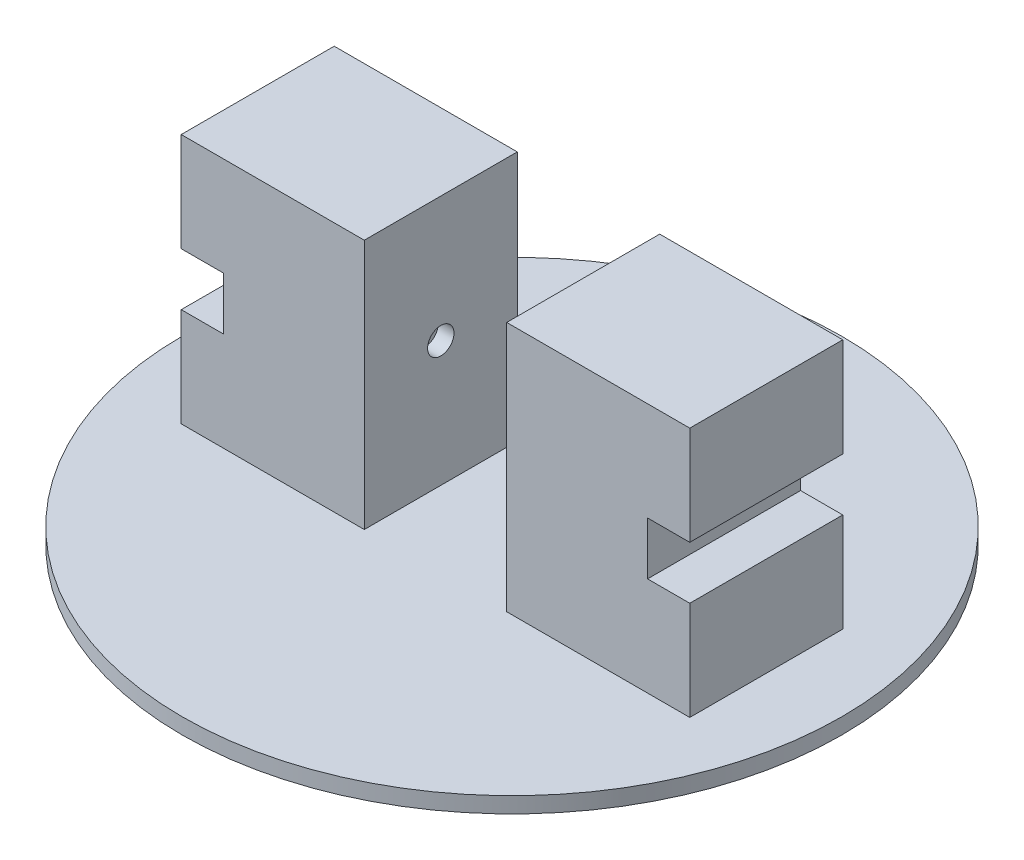
ISO-10303-21;
HEADER;
FILE_DESCRIPTION(('STEP AP214'),'2;1');
FILE_NAME('part.step','',(''),(''),'','','');
FILE_SCHEMA(('AUTOMOTIVE_DESIGN { 1 0 10303 214 1 1 1 1 }'));
ENDSEC;
DATA;
#1=APPLICATION_CONTEXT('core data for automotive mechanical design processes');
#2=APPLICATION_PROTOCOL_DEFINITION('international standard','automotive_design',2000,#1);
#3=PRODUCT_CONTEXT('',#1,'mechanical');
#4=PRODUCT('Part','Part','',(#3));
#5=PRODUCT_RELATED_PRODUCT_CATEGORY('part','',(#4));
#6=PRODUCT_DEFINITION_FORMATION('','',#4);
#7=PRODUCT_DEFINITION_CONTEXT('part definition',#1,'design');
#8=PRODUCT_DEFINITION('design','',#6,#7);
#9=PRODUCT_DEFINITION_SHAPE('','',#8);
#10=(LENGTH_UNIT() NAMED_UNIT(*) SI_UNIT(.MILLI.,.METRE.));
#11=(NAMED_UNIT(*) PLANE_ANGLE_UNIT() SI_UNIT($,.RADIAN.));
#12=(NAMED_UNIT(*) SI_UNIT($,.STERADIAN.) SOLID_ANGLE_UNIT());
#13=UNCERTAINTY_MEASURE_WITH_UNIT(LENGTH_MEASURE(1.E-05),#10,'distance_accuracy_value','');
#14=(GEOMETRIC_REPRESENTATION_CONTEXT(3) GLOBAL_UNCERTAINTY_ASSIGNED_CONTEXT((#13)) GLOBAL_UNIT_ASSIGNED_CONTEXT((#10,
#11,#12)) REPRESENTATION_CONTEXT('',''));
#15=CARTESIAN_POINT('',(0.,0.,0.));
#16=DIRECTION('',(0.,0.,1.));
#17=DIRECTION('',(1.,0.,0.));
#18=AXIS2_PLACEMENT_3D('',#15,#16,#17);
#19=CARTESIAN_POINT('',(34.7,0.,29.));
#20=DIRECTION('',(-1.,0.,0.));
#21=DIRECTION('',(0.,0.,1.));
#22=AXIS2_PLACEMENT_3D('',#19,#20,#21);
#23=PLANE('',#22);
#24=DIRECTION('',(0.,1.,0.));
#25=VECTOR('',#24,1.);
#26=CARTESIAN_POINT('',(34.7,0.,29.));
#27=LINE('',#26,#25);
#28=CARTESIAN_POINT('',(34.7,28.75,29.));
#29=VERTEX_POINT('',#28);
#30=CARTESIAN_POINT('',(34.7,47.5,29.));
#31=VERTEX_POINT('',#30);
#32=EDGE_CURVE('E248',#29,#31,#27,.T.);
#33=ORIENTED_EDGE('',*,*,#32,.F.);
#34=DIRECTION('',(0.,0.,1.));
#35=VECTOR('',#34,1.);
#36=CARTESIAN_POINT('',(34.7,28.75,29.));
#37=LINE('',#36,#35);
#38=CARTESIAN_POINT('',(34.7,28.75,0.));
#39=VERTEX_POINT('',#38);
#40=EDGE_CURVE('E223',#39,#29,#37,.T.);
#41=ORIENTED_EDGE('',*,*,#40,.F.);
#42=DIRECTION('',(0.,1.,0.));
#43=VECTOR('',#42,1.);
#44=CARTESIAN_POINT('',(34.7,0.,0.));
#45=LINE('',#44,#43);
#46=CARTESIAN_POINT('',(34.7,47.5,0.));
#47=VERTEX_POINT('',#46);
#48=EDGE_CURVE('E259',#39,#47,#45,.T.);
#49=ORIENTED_EDGE('',*,*,#48,.T.);
#50=DIRECTION('',(0.,0.,-1.));
#51=VECTOR('',#50,1.);
#52=CARTESIAN_POINT('',(34.7,47.5,29.));
#53=LINE('',#52,#51);
#54=EDGE_CURVE('E266',#31,#47,#53,.T.);
#55=ORIENTED_EDGE('',*,*,#54,.F.);
#56=EDGE_LOOP('',(#33,#41,#49,#55));
#57=FACE_BOUND('',#56,.T.);
#58=ADVANCED_FACE('F38',(#57),#23,.F.);
#59=CARTESIAN_POINT('',(0.,0.,29.));
#60=DIRECTION('',(1.,0.,0.));
#61=DIRECTION('',(0.,0.,-1.));
#62=AXIS2_PLACEMENT_3D('',#59,#60,#61);
#63=PLANE('',#62);
#64=CARTESIAN_POINT('',(0.,23.75,14.5));
#65=DIRECTION('',(-1.,0.,0.));
#66=DIRECTION('',(0.,0.,1.));
#67=AXIS2_PLACEMENT_3D('',#64,#65,#66);
#68=CIRCLE('',#67,2.5);
#69=CARTESIAN_POINT('',(0.,23.75,17.));
#70=VERTEX_POINT('',#69);
#71=EDGE_CURVE('E559',#70,#70,#68,.T.);
#72=ORIENTED_EDGE('',*,*,#71,.F.);
#73=EDGE_LOOP('',(#72));
#74=FACE_BOUND('',#73,.T.);
#75=DIRECTION('',(0.,-1.,0.));
#76=VECTOR('',#75,1.);
#77=CARTESIAN_POINT('',(0.,0.,0.));
#78=LINE('',#77,#76);
#79=CARTESIAN_POINT('',(0.,47.5,0.));
#80=VERTEX_POINT('',#79);
#81=CARTESIAN_POINT('',(0.,0.,0.));
#82=VERTEX_POINT('',#81);
#83=EDGE_CURVE('E236',#80,#82,#78,.T.);
#84=ORIENTED_EDGE('',*,*,#83,.T.);
#85=DIRECTION('',(0.,0.,-1.));
#86=VECTOR('',#85,1.);
#87=CARTESIAN_POINT('',(0.,0.,29.));
#88=LINE('',#87,#86);
#89=CARTESIAN_POINT('',(0.,0.,29.));
#90=VERTEX_POINT('',#89);
#91=EDGE_CURVE('E11',#90,#82,#88,.T.);
#92=ORIENTED_EDGE('',*,*,#91,.F.);
#93=DIRECTION('',(0.,-1.,0.));
#94=VECTOR('',#93,1.);
#95=CARTESIAN_POINT('',(0.,0.,29.));
#96=LINE('',#95,#94);
#97=CARTESIAN_POINT('',(0.,47.5,29.));
#98=VERTEX_POINT('',#97);
#99=EDGE_CURVE('E243',#98,#90,#96,.T.);
#100=ORIENTED_EDGE('',*,*,#99,.F.);
#101=DIRECTION('',(0.,0.,-1.));
#102=VECTOR('',#101,1.);
#103=CARTESIAN_POINT('',(0.,47.5,29.));
#104=LINE('',#103,#102);
#105=EDGE_CURVE('E254',#98,#80,#104,.T.);
#106=ORIENTED_EDGE('',*,*,#105,.T.);
#107=EDGE_LOOP('',(#84,#92,#100,#106));
#108=FACE_BOUND('',#107,.T.);
#109=ADVANCED_FACE('F40',(#74,#108),#63,.F.);
#110=CARTESIAN_POINT('',(34.7,0.,0.));
#111=VERTEX_POINT('',#110);
#112=CARTESIAN_POINT('',(34.7,18.75,0.));
#113=VERTEX_POINT('',#112);
#114=EDGE_CURVE('E260',#111,#113,#45,.T.);
#115=ORIENTED_EDGE('',*,*,#114,.T.);
#116=DIRECTION('',(0.,0.,-1.));
#117=VECTOR('',#116,1.);
#118=CARTESIAN_POINT('',(34.7,18.75,29.));
#119=LINE('',#118,#117);
#120=CARTESIAN_POINT('',(34.7,18.75,29.));
#121=VERTEX_POINT('',#120);
#122=EDGE_CURVE('E216',#121,#113,#119,.T.);
#123=ORIENTED_EDGE('',*,*,#122,.F.);
#124=CARTESIAN_POINT('',(34.7,0.,29.));
#125=VERTEX_POINT('',#124);
#126=EDGE_CURVE('E249',#125,#121,#27,.T.);
#127=ORIENTED_EDGE('',*,*,#126,.F.);
#128=DIRECTION('',(0.,0.,-1.));
#129=VECTOR('',#128,1.);
#130=CARTESIAN_POINT('',(34.7,0.,29.));
#131=LINE('',#130,#129);
#132=EDGE_CURVE('E47',#125,#111,#131,.T.);
#133=ORIENTED_EDGE('',*,*,#132,.T.);
#134=EDGE_LOOP('',(#115,#123,#127,#133));
#135=FACE_BOUND('',#134,.T.);
#136=ADVANCED_FACE('F273',(#135),#23,.F.);
#137=CARTESIAN_POINT('',(0.,47.5,29.));
#138=DIRECTION('',(0.,-1.,0.));
#139=DIRECTION('',(0.,0.,-1.));
#140=AXIS2_PLACEMENT_3D('',#137,#138,#139);
#141=PLANE('',#140);
#142=DIRECTION('',(-1.,0.,0.));
#143=VECTOR('',#142,1.);
#144=CARTESIAN_POINT('',(0.,47.5,0.));
#145=LINE('',#144,#143);
#146=EDGE_CURVE('E246',#47,#80,#145,.T.);
#147=ORIENTED_EDGE('',*,*,#146,.T.);
#148=ORIENTED_EDGE('',*,*,#105,.F.);
#149=DIRECTION('',(-1.,0.,0.));
#150=VECTOR('',#149,1.);
#151=CARTESIAN_POINT('',(0.,47.5,29.));
#152=LINE('',#151,#150);
#153=EDGE_CURVE('E252',#31,#98,#152,.T.);
#154=ORIENTED_EDGE('',*,*,#153,.F.);
#155=ORIENTED_EDGE('',*,*,#54,.T.);
#156=EDGE_LOOP('',(#147,#148,#154,#155));
#157=FACE_BOUND('',#156,.T.);
#158=ADVANCED_FACE('F292',(#157),#141,.F.);
#159=CARTESIAN_POINT('',(0.,0.,29.));
#160=DIRECTION('',(0.,0.,-1.));
#161=DIRECTION('',(-1.,0.,0.));
#162=AXIS2_PLACEMENT_3D('',#159,#160,#161);
#163=PLANE('',#162);
#164=DIRECTION('',(0.,-1.,0.));
#165=VECTOR('',#164,1.);
#166=CARTESIAN_POINT('',(26.7,28.75,29.));
#167=LINE('',#166,#165);
#168=CARTESIAN_POINT('',(26.7,28.75,29.));
#169=VERTEX_POINT('',#168);
#170=CARTESIAN_POINT('',(26.7,18.75,29.));
#171=VERTEX_POINT('',#170);
#172=EDGE_CURVE('E219',#169,#171,#167,.T.);
#173=ORIENTED_EDGE('',*,*,#172,.F.);
#174=DIRECTION('',(1.,0.,0.));
#175=VECTOR('',#174,1.);
#176=CARTESIAN_POINT('',(26.7,28.75,29.));
#177=LINE('',#176,#175);
#178=EDGE_CURVE('E233',#169,#29,#177,.T.);
#179=ORIENTED_EDGE('',*,*,#178,.T.);
#180=ORIENTED_EDGE('',*,*,#32,.T.);
#181=ORIENTED_EDGE('',*,*,#153,.T.);
#182=ORIENTED_EDGE('',*,*,#99,.T.);
#183=DIRECTION('',(1.,0.,0.));
#184=VECTOR('',#183,1.);
#185=CARTESIAN_POINT('',(0.,0.,29.));
#186=LINE('',#185,#184);
#187=EDGE_CURVE('E245',#90,#125,#186,.T.);
#188=ORIENTED_EDGE('',*,*,#187,.T.);
#189=ORIENTED_EDGE('',*,*,#126,.T.);
#190=DIRECTION('',(1.,0.,0.));
#191=VECTOR('',#190,1.);
#192=CARTESIAN_POINT('',(26.7,18.75,29.));
#193=LINE('',#192,#191);
#194=EDGE_CURVE('E230',#171,#121,#193,.T.);
#195=ORIENTED_EDGE('',*,*,#194,.F.);
#196=EDGE_LOOP('',(#173,#179,#180,#181,#182,#188,#189,#195));
#197=FACE_BOUND('',#196,.T.);
#198=ADVANCED_FACE('F303',(#197),#163,.F.);
#199=CARTESIAN_POINT('',(0.,0.,0.));
#200=DIRECTION('',(0.,0.,-1.));
#201=DIRECTION('',(-1.,0.,0.));
#202=AXIS2_PLACEMENT_3D('',#199,#200,#201);
#203=PLANE('',#202);
#204=DIRECTION('',(1.,0.,0.));
#205=VECTOR('',#204,1.);
#206=CARTESIAN_POINT('',(26.7,28.75,0.));
#207=LINE('',#206,#205);
#208=CARTESIAN_POINT('',(26.7,28.75,0.));
#209=VERTEX_POINT('',#208);
#210=EDGE_CURVE('E237',#209,#39,#207,.T.);
#211=ORIENTED_EDGE('',*,*,#210,.F.);
#212=DIRECTION('',(0.,1.,0.));
#213=VECTOR('',#212,1.);
#214=CARTESIAN_POINT('',(26.7,28.75,0.));
#215=LINE('',#214,#213);
#216=CARTESIAN_POINT('',(26.7,18.75,0.));
#217=VERTEX_POINT('',#216);
#218=EDGE_CURVE('E225',#217,#209,#215,.T.);
#219=ORIENTED_EDGE('',*,*,#218,.F.);
#220=DIRECTION('',(1.,0.,0.));
#221=VECTOR('',#220,1.);
#222=CARTESIAN_POINT('',(26.7,18.75,0.));
#223=LINE('',#222,#221);
#224=EDGE_CURVE('E239',#217,#113,#223,.T.);
#225=ORIENTED_EDGE('',*,*,#224,.T.);
#226=ORIENTED_EDGE('',*,*,#114,.F.);
#227=DIRECTION('',(1.,0.,0.));
#228=VECTOR('',#227,1.);
#229=CARTESIAN_POINT('',(0.,0.,0.));
#230=LINE('',#229,#228);
#231=EDGE_CURVE('E256',#82,#111,#230,.T.);
#232=ORIENTED_EDGE('',*,*,#231,.F.);
#233=ORIENTED_EDGE('',*,*,#83,.F.);
#234=ORIENTED_EDGE('',*,*,#146,.F.);
#235=ORIENTED_EDGE('',*,*,#48,.F.);
#236=EDGE_LOOP('',(#211,#219,#225,#226,#232,#233,#234,#235));
#237=FACE_BOUND('',#236,.T.);
#238=ADVANCED_FACE('F280',(#237),#203,.T.);
#239=CARTESIAN_POINT('',(26.7,28.75,29.));
#240=DIRECTION('',(0.,1.,0.));
#241=DIRECTION('',(0.,0.,1.));
#242=AXIS2_PLACEMENT_3D('',#239,#240,#241);
#243=PLANE('',#242);
#244=ORIENTED_EDGE('',*,*,#40,.T.);
#245=ORIENTED_EDGE('',*,*,#178,.F.);
#246=DIRECTION('',(0.,0.,1.));
#247=VECTOR('',#246,1.);
#248=CARTESIAN_POINT('',(26.7,28.75,29.));
#249=LINE('',#248,#247);
#250=EDGE_CURVE('E227',#209,#169,#249,.T.);
#251=ORIENTED_EDGE('',*,*,#250,.F.);
#252=ORIENTED_EDGE('',*,*,#210,.T.);
#253=EDGE_LOOP('',(#244,#245,#251,#252));
#254=FACE_BOUND('',#253,.T.);
#255=ADVANCED_FACE('F299',(#254),#243,.F.);
#256=CARTESIAN_POINT('',(26.7,18.75,29.));
#257=DIRECTION('',(0.,-1.,0.));
#258=DIRECTION('',(0.,0.,-1.));
#259=AXIS2_PLACEMENT_3D('',#256,#257,#258);
#260=PLANE('',#259);
#261=ORIENTED_EDGE('',*,*,#122,.T.);
#262=ORIENTED_EDGE('',*,*,#224,.F.);
#263=DIRECTION('',(0.,0.,-1.));
#264=VECTOR('',#263,1.);
#265=CARTESIAN_POINT('',(26.7,18.75,29.));
#266=LINE('',#265,#264);
#267=EDGE_CURVE('E222',#171,#217,#266,.T.);
#268=ORIENTED_EDGE('',*,*,#267,.F.);
#269=ORIENTED_EDGE('',*,*,#194,.T.);
#270=EDGE_LOOP('',(#261,#262,#268,#269));
#271=FACE_BOUND('',#270,.T.);
#272=ADVANCED_FACE('F308',(#271),#260,.F.);
#273=CARTESIAN_POINT('',(26.7,0.,0.));
#274=DIRECTION('',(1.,0.,0.));
#275=DIRECTION('',(0.,0.,-1.));
#276=AXIS2_PLACEMENT_3D('',#273,#274,#275);
#277=PLANE('',#276);
#278=ORIENTED_EDGE('',*,*,#172,.T.);
#279=ORIENTED_EDGE('',*,*,#267,.T.);
#280=ORIENTED_EDGE('',*,*,#218,.T.);
#281=ORIENTED_EDGE('',*,*,#250,.T.);
#282=EDGE_LOOP('',(#278,#279,#280,#281));
#283=FACE_BOUND('',#282,.T.);
#284=ADVANCED_FACE('F306',(#283),#277,.T.);
#285=CARTESIAN_POINT('',(-13.5,0.,14.5));
#286=DIRECTION('',(0.,-1.,0.));
#287=DIRECTION('',(0.,0.,-1.));
#288=AXIS2_PLACEMENT_3D('',#285,#286,#287);
#289=PLANE('',#288);
#290=DIRECTION('',(0.,0.,-1.));
#291=VECTOR('',#290,1.);
#292=CARTESIAN_POINT('',(-27.,0.,29.));
#293=LINE('',#292,#291);
#294=CARTESIAN_POINT('',(-27.,0.,29.));
#295=VERTEX_POINT('',#294);
#296=CARTESIAN_POINT('',(-27.,0.,0.));
#297=VERTEX_POINT('',#296);
#298=EDGE_CURVE('E54',#295,#297,#293,.T.);
#299=ORIENTED_EDGE('',*,*,#298,.F.);
#300=DIRECTION('',(1.,0.,0.));
#301=VECTOR('',#300,1.);
#302=CARTESIAN_POINT('',(-27.,0.,29.));
#303=LINE('',#302,#301);
#304=CARTESIAN_POINT('',(-61.7,0.,29.));
#305=VERTEX_POINT('',#304);
#306=EDGE_CURVE('E58',#305,#295,#303,.T.);
#307=ORIENTED_EDGE('',*,*,#306,.F.);
#308=DIRECTION('',(0.,0.,-1.));
#309=VECTOR('',#308,1.);
#310=CARTESIAN_POINT('',(-61.7,0.,29.));
#311=LINE('',#310,#309);
#312=CARTESIAN_POINT('',(-61.7,0.,0.));
#313=VERTEX_POINT('',#312);
#314=EDGE_CURVE('E204',#305,#313,#311,.T.);
#315=ORIENTED_EDGE('',*,*,#314,.T.);
#316=DIRECTION('',(1.,0.,0.));
#317=VECTOR('',#316,1.);
#318=CARTESIAN_POINT('',(-27.,0.,0.));
#319=LINE('',#318,#317);
#320=EDGE_CURVE('E186',#313,#297,#319,.T.);
#321=ORIENTED_EDGE('',*,*,#320,.T.);
#322=EDGE_LOOP('',(#299,#307,#315,#321));
#323=FACE_BOUND('',#322,.T.);
#324=CARTESIAN_POINT('',(-13.5,0.,14.5));
#325=DIRECTION('',(0.,-1.,0.));
#326=DIRECTION('',(0.,0.,-1.));
#327=AXIS2_PLACEMENT_3D('',#324,#325,#326);
#328=CIRCLE('',#327,62.5);
#329=CARTESIAN_POINT('',(-13.5,0.,-48.));
#330=VERTEX_POINT('',#329);
#331=EDGE_CURVE('E212',#330,#330,#328,.T.);
#332=ORIENTED_EDGE('',*,*,#331,.F.);
#333=EDGE_LOOP('',(#332));
#334=FACE_BOUND('',#333,.T.);
#335=ORIENTED_EDGE('',*,*,#91,.T.);
#336=ORIENTED_EDGE('',*,*,#231,.T.);
#337=ORIENTED_EDGE('',*,*,#132,.F.);
#338=ORIENTED_EDGE('',*,*,#187,.F.);
#339=EDGE_LOOP('',(#335,#336,#337,#338));
#340=FACE_BOUND('',#339,.T.);
#341=ADVANCED_FACE('F284',(#323,#334,#340),#289,.F.);
#342=CARTESIAN_POINT('',(-13.5,-3.,14.5));
#343=DIRECTION('',(0.,1.,0.));
#344=DIRECTION('',(0.,0.,1.));
#345=AXIS2_PLACEMENT_3D('',#342,#343,#344);
#346=CYLINDRICAL_SURFACE('',#345,62.5);
#347=CARTESIAN_POINT('',(-13.5,-3.,14.5));
#348=DIRECTION('',(0.,-1.,0.));
#349=DIRECTION('',(0.,0.,-1.));
#350=AXIS2_PLACEMENT_3D('',#347,#348,#349);
#351=CIRCLE('',#350,62.5);
#352=CARTESIAN_POINT('',(-13.5,-3.,-48.));
#353=VERTEX_POINT('',#352);
#354=EDGE_CURVE('E213',#353,#353,#351,.T.);
#355=ORIENTED_EDGE('',*,*,#354,.F.);
#356=EDGE_LOOP('',(#355));
#357=FACE_BOUND('',#356,.T.);
#358=ORIENTED_EDGE('',*,*,#331,.T.);
#359=EDGE_LOOP('',(#358));
#360=FACE_BOUND('',#359,.T.);
#361=ADVANCED_FACE('F455',(#357,#360),#346,.T.);
#362=CARTESIAN_POINT('',(-13.5,-3.,14.5));
#363=DIRECTION('',(0.,-1.,0.));
#364=DIRECTION('',(0.,0.,-1.));
#365=AXIS2_PLACEMENT_3D('',#362,#363,#364);
#366=PLANE('',#365);
#367=ORIENTED_EDGE('',*,*,#354,.T.);
#368=EDGE_LOOP('',(#367));
#369=FACE_BOUND('',#368,.T.);
#370=ADVANCED_FACE('F452',(#369),#366,.T.);
#371=CARTESIAN_POINT('',(-61.7,0.,29.));
#372=DIRECTION('',(1.,0.,0.));
#373=DIRECTION('',(0.,0.,-1.));
#374=AXIS2_PLACEMENT_3D('',#371,#372,#373);
#375=PLANE('',#374);
#376=DIRECTION('',(0.,-1.,0.));
#377=VECTOR('',#376,1.);
#378=CARTESIAN_POINT('',(-61.7,0.,0.));
#379=LINE('',#378,#377);
#380=CARTESIAN_POINT('',(-61.7,47.5,0.));
#381=VERTEX_POINT('',#380);
#382=CARTESIAN_POINT('',(-61.7,28.75,0.));
#383=VERTEX_POINT('',#382);
#384=EDGE_CURVE('E199',#381,#383,#379,.T.);
#385=ORIENTED_EDGE('',*,*,#384,.T.);
#386=DIRECTION('',(0.,0.,-1.));
#387=VECTOR('',#386,1.);
#388=CARTESIAN_POINT('',(-61.7,28.75,0.));
#389=LINE('',#388,#387);
#390=CARTESIAN_POINT('',(-61.7,28.75,29.));
#391=VERTEX_POINT('',#390);
#392=EDGE_CURVE('E169',#391,#383,#389,.T.);
#393=ORIENTED_EDGE('',*,*,#392,.F.);
#394=DIRECTION('',(0.,-1.,0.));
#395=VECTOR('',#394,1.);
#396=CARTESIAN_POINT('',(-61.7,0.,29.));
#397=LINE('',#396,#395);
#398=CARTESIAN_POINT('',(-61.7,47.5,29.));
#399=VERTEX_POINT('',#398);
#400=EDGE_CURVE('E189',#399,#391,#397,.T.);
#401=ORIENTED_EDGE('',*,*,#400,.F.);
#402=DIRECTION('',(0.,0.,-1.));
#403=VECTOR('',#402,1.);
#404=CARTESIAN_POINT('',(-61.7,47.5,29.));
#405=LINE('',#404,#403);
#406=EDGE_CURVE('E206',#399,#381,#405,.T.);
#407=ORIENTED_EDGE('',*,*,#406,.T.);
#408=EDGE_LOOP('',(#385,#393,#401,#407));
#409=FACE_BOUND('',#408,.T.);
#410=ADVANCED_FACE('F444',(#409),#375,.F.);
#411=CARTESIAN_POINT('',(-27.,0.,29.));
#412=DIRECTION('',(-1.,0.,0.));
#413=DIRECTION('',(0.,0.,1.));
#414=AXIS2_PLACEMENT_3D('',#411,#412,#413);
#415=PLANE('',#414);
#416=CARTESIAN_POINT('',(-27.,23.75,14.5));
#417=DIRECTION('',(-1.,0.,0.));
#418=DIRECTION('',(0.,0.,1.));
#419=AXIS2_PLACEMENT_3D('',#416,#417,#418);
#420=CIRCLE('',#419,2.5);
#421=CARTESIAN_POINT('',(-27.,23.75,17.));
#422=VERTEX_POINT('',#421);
#423=EDGE_CURVE('E42',#422,#422,#420,.F.);
#424=ORIENTED_EDGE('',*,*,#423,.F.);
#425=EDGE_LOOP('',(#424));
#426=FACE_BOUND('',#425,.T.);
#427=DIRECTION('',(0.,1.,0.));
#428=VECTOR('',#427,1.);
#429=CARTESIAN_POINT('',(-27.,0.,0.));
#430=LINE('',#429,#428);
#431=CARTESIAN_POINT('',(-27.,47.5,0.));
#432=VERTEX_POINT('',#431);
#433=EDGE_CURVE('E193',#297,#432,#430,.T.);
#434=ORIENTED_EDGE('',*,*,#433,.T.);
#435=DIRECTION('',(0.,0.,-1.));
#436=VECTOR('',#435,1.);
#437=CARTESIAN_POINT('',(-27.,47.5,29.));
#438=LINE('',#437,#436);
#439=CARTESIAN_POINT('',(-27.,47.5,29.));
#440=VERTEX_POINT('',#439);
#441=EDGE_CURVE('E209',#440,#432,#438,.T.);
#442=ORIENTED_EDGE('',*,*,#441,.F.);
#443=DIRECTION('',(0.,1.,0.));
#444=VECTOR('',#443,1.);
#445=CARTESIAN_POINT('',(-27.,0.,29.));
#446=LINE('',#445,#444);
#447=EDGE_CURVE('E182',#295,#440,#446,.T.);
#448=ORIENTED_EDGE('',*,*,#447,.F.);
#449=ORIENTED_EDGE('',*,*,#298,.T.);
#450=EDGE_LOOP('',(#434,#442,#448,#449));
#451=FACE_BOUND('',#450,.T.);
#452=ADVANCED_FACE('F447',(#426,#451),#415,.F.);
#453=CARTESIAN_POINT('',(-27.,47.5,29.));
#454=DIRECTION('',(0.,-1.,0.));
#455=DIRECTION('',(1.,0.,0.));
#456=AXIS2_PLACEMENT_3D('',#453,#454,#455);
#457=PLANE('',#456);
#458=DIRECTION('',(-1.,0.,0.));
#459=VECTOR('',#458,1.);
#460=CARTESIAN_POINT('',(-27.,47.5,0.));
#461=LINE('',#460,#459);
#462=EDGE_CURVE('E196',#432,#381,#461,.T.);
#463=ORIENTED_EDGE('',*,*,#462,.T.);
#464=ORIENTED_EDGE('',*,*,#406,.F.);
#465=DIRECTION('',(-1.,0.,0.));
#466=VECTOR('',#465,1.);
#467=CARTESIAN_POINT('',(-27.,47.5,29.));
#468=LINE('',#467,#466);
#469=EDGE_CURVE('E185',#440,#399,#468,.T.);
#470=ORIENTED_EDGE('',*,*,#469,.F.);
#471=ORIENTED_EDGE('',*,*,#441,.T.);
#472=EDGE_LOOP('',(#463,#464,#470,#471));
#473=FACE_BOUND('',#472,.T.);
#474=ADVANCED_FACE('F442',(#473),#457,.F.);
#475=CARTESIAN_POINT('',(-61.7,18.75,29.));
#476=VERTEX_POINT('',#475);
#477=EDGE_CURVE('E188',#476,#305,#397,.T.);
#478=ORIENTED_EDGE('',*,*,#477,.F.);
#479=DIRECTION('',(0.,0.,1.));
#480=VECTOR('',#479,1.);
#481=CARTESIAN_POINT('',(-61.7,18.75,0.));
#482=LINE('',#481,#480);
#483=CARTESIAN_POINT('',(-61.7,18.75,0.));
#484=VERTEX_POINT('',#483);
#485=EDGE_CURVE('E552',#484,#476,#482,.T.);
#486=ORIENTED_EDGE('',*,*,#485,.F.);
#487=EDGE_CURVE('E175',#484,#313,#379,.T.);
#488=ORIENTED_EDGE('',*,*,#487,.T.);
#489=ORIENTED_EDGE('',*,*,#314,.F.);
#490=EDGE_LOOP('',(#478,#486,#488,#489));
#491=FACE_BOUND('',#490,.T.);
#492=ADVANCED_FACE('F436',(#491),#375,.F.);
#493=CARTESIAN_POINT('',(0.,0.,29.));
#494=DIRECTION('',(0.,0.,1.));
#495=DIRECTION('',(1.,0.,0.));
#496=AXIS2_PLACEMENT_3D('',#493,#494,#495);
#497=PLANE('',#496);
#498=DIRECTION('',(-1.,0.,0.));
#499=VECTOR('',#498,1.);
#500=CARTESIAN_POINT('',(-53.7,28.75,29.));
#501=LINE('',#500,#499);
#502=CARTESIAN_POINT('',(-53.7,28.75,29.));
#503=VERTEX_POINT('',#502);
#504=EDGE_CURVE('E177',#503,#391,#501,.T.);
#505=ORIENTED_EDGE('',*,*,#504,.F.);
#506=DIRECTION('',(0.,1.,0.));
#507=VECTOR('',#506,1.);
#508=CARTESIAN_POINT('',(-53.7,28.75,29.));
#509=LINE('',#508,#507);
#510=CARTESIAN_POINT('',(-53.7,18.75,29.));
#511=VERTEX_POINT('',#510);
#512=EDGE_CURVE('E159',#511,#503,#509,.T.);
#513=ORIENTED_EDGE('',*,*,#512,.F.);
#514=DIRECTION('',(-1.,0.,0.));
#515=VECTOR('',#514,1.);
#516=CARTESIAN_POINT('',(-53.7,18.75,29.));
#517=LINE('',#516,#515);
#518=EDGE_CURVE('E156',#511,#476,#517,.T.);
#519=ORIENTED_EDGE('',*,*,#518,.T.);
#520=ORIENTED_EDGE('',*,*,#477,.T.);
#521=ORIENTED_EDGE('',*,*,#306,.T.);
#522=ORIENTED_EDGE('',*,*,#447,.T.);
#523=ORIENTED_EDGE('',*,*,#469,.T.);
#524=ORIENTED_EDGE('',*,*,#400,.T.);
#525=EDGE_LOOP('',(#505,#513,#519,#520,#521,#522,#523,#524));
#526=FACE_BOUND('',#525,.T.);
#527=ADVANCED_FACE('F433',(#526),#497,.T.);
#528=CARTESIAN_POINT('',(0.,0.,0.));
#529=DIRECTION('',(0.,0.,1.));
#530=DIRECTION('',(1.,0.,0.));
#531=AXIS2_PLACEMENT_3D('',#528,#529,#530);
#532=PLANE('',#531);
#533=DIRECTION('',(0.,-1.,0.));
#534=VECTOR('',#533,1.);
#535=CARTESIAN_POINT('',(-53.7,28.75,0.));
#536=LINE('',#535,#534);
#537=CARTESIAN_POINT('',(-53.7,28.75,0.));
#538=VERTEX_POINT('',#537);
#539=CARTESIAN_POINT('',(-53.7,18.75,0.));
#540=VERTEX_POINT('',#539);
#541=EDGE_CURVE('E160',#538,#540,#536,.T.);
#542=ORIENTED_EDGE('',*,*,#541,.F.);
#543=DIRECTION('',(-1.,0.,0.));
#544=VECTOR('',#543,1.);
#545=CARTESIAN_POINT('',(-53.7,28.75,0.));
#546=LINE('',#545,#544);
#547=EDGE_CURVE('E197',#538,#383,#546,.T.);
#548=ORIENTED_EDGE('',*,*,#547,.T.);
#549=ORIENTED_EDGE('',*,*,#384,.F.);
#550=ORIENTED_EDGE('',*,*,#462,.F.);
#551=ORIENTED_EDGE('',*,*,#433,.F.);
#552=ORIENTED_EDGE('',*,*,#320,.F.);
#553=ORIENTED_EDGE('',*,*,#487,.F.);
#554=DIRECTION('',(-1.,0.,0.));
#555=VECTOR('',#554,1.);
#556=CARTESIAN_POINT('',(-53.7,18.75,0.));
#557=LINE('',#556,#555);
#558=EDGE_CURVE('E153',#540,#484,#557,.T.);
#559=ORIENTED_EDGE('',*,*,#558,.F.);
#560=EDGE_LOOP('',(#542,#548,#549,#550,#551,#552,#553,#559));
#561=FACE_BOUND('',#560,.T.);
#562=ADVANCED_FACE('F172',(#561),#532,.F.);
#563=CARTESIAN_POINT('',(-53.7,28.75,0.));
#564=DIRECTION('',(0.,1.,0.));
#565=DIRECTION('',(0.,0.,1.));
#566=AXIS2_PLACEMENT_3D('',#563,#564,#565);
#567=PLANE('',#566);
#568=ORIENTED_EDGE('',*,*,#392,.T.);
#569=ORIENTED_EDGE('',*,*,#547,.F.);
#570=DIRECTION('',(0.,0.,-1.));
#571=VECTOR('',#570,1.);
#572=CARTESIAN_POINT('',(-53.7,28.75,0.));
#573=LINE('',#572,#571);
#574=EDGE_CURVE('E165',#503,#538,#573,.T.);
#575=ORIENTED_EDGE('',*,*,#574,.F.);
#576=ORIENTED_EDGE('',*,*,#504,.T.);
#577=EDGE_LOOP('',(#568,#569,#575,#576));
#578=FACE_BOUND('',#577,.T.);
#579=ADVANCED_FACE('F427',(#578),#567,.F.);
#580=CARTESIAN_POINT('',(-53.7,18.75,0.));
#581=DIRECTION('',(0.,-1.,0.));
#582=DIRECTION('',(0.,0.,-1.));
#583=AXIS2_PLACEMENT_3D('',#580,#581,#582);
#584=PLANE('',#583);
#585=ORIENTED_EDGE('',*,*,#485,.T.);
#586=ORIENTED_EDGE('',*,*,#518,.F.);
#587=DIRECTION('',(0.,0.,1.));
#588=VECTOR('',#587,1.);
#589=CARTESIAN_POINT('',(-53.7,18.75,0.));
#590=LINE('',#589,#588);
#591=EDGE_CURVE('E149',#540,#511,#590,.T.);
#592=ORIENTED_EDGE('',*,*,#591,.F.);
#593=ORIENTED_EDGE('',*,*,#558,.T.);
#594=EDGE_LOOP('',(#585,#586,#592,#593));
#595=FACE_BOUND('',#594,.T.);
#596=ADVANCED_FACE('F151',(#595),#584,.F.);
#597=CARTESIAN_POINT('',(-53.7,0.,0.));
#598=DIRECTION('',(-1.,0.,0.));
#599=DIRECTION('',(0.,0.,1.));
#600=AXIS2_PLACEMENT_3D('',#597,#598,#599);
#601=PLANE('',#600);
#602=ORIENTED_EDGE('',*,*,#541,.T.);
#603=ORIENTED_EDGE('',*,*,#591,.T.);
#604=ORIENTED_EDGE('',*,*,#512,.T.);
#605=ORIENTED_EDGE('',*,*,#574,.T.);
#606=EDGE_LOOP('',(#602,#603,#604,#605));
#607=FACE_BOUND('',#606,.T.);
#608=ADVANCED_FACE('F163',(#607),#601,.T.);
#609=CARTESIAN_POINT('',(-5.,23.75,14.5));
#610=DIRECTION('',(-1.,0.,0.));
#611=DIRECTION('',(0.,0.,1.));
#612=AXIS2_PLACEMENT_3D('',#609,#610,#611);
#613=CYLINDRICAL_SURFACE('',#612,2.5);
#614=CARTESIAN_POINT('',(-30.,23.75,14.5));
#615=DIRECTION('',(1.,0.,0.));
#616=DIRECTION('',(0.,0.,-1.));
#617=AXIS2_PLACEMENT_3D('',#614,#615,#616);
#618=CIRCLE('',#617,2.5);
#619=CARTESIAN_POINT('',(-30.,23.75,12.));
#620=VERTEX_POINT('',#619);
#621=EDGE_CURVE('E555',#620,#620,#618,.T.);
#622=ORIENTED_EDGE('',*,*,#621,.F.);
#623=EDGE_LOOP('',(#622));
#624=FACE_BOUND('',#623,.T.);
#625=ORIENTED_EDGE('',*,*,#423,.T.);
#626=EDGE_LOOP('',(#625));
#627=FACE_BOUND('',#626,.T.);
#628=ADVANCED_FACE('F420',(#624,#627),#613,.F.);
#629=CARTESIAN_POINT('',(-30.,23.75,14.5));
#630=DIRECTION('',(1.,0.,0.));
#631=DIRECTION('',(0.,0.,-1.));
#632=AXIS2_PLACEMENT_3D('',#629,#630,#631);
#633=PLANE('',#632);
#634=ORIENTED_EDGE('',*,*,#621,.T.);
#635=EDGE_LOOP('',(#634));
#636=FACE_BOUND('',#635,.T.);
#637=ADVANCED_FACE('F384',(#636),#633,.T.);
#638=CARTESIAN_POINT('',(3.,23.75,14.5));
#639=DIRECTION('',(-1.,0.,0.));
#640=DIRECTION('',(0.,0.,1.));
#641=AXIS2_PLACEMENT_3D('',#638,#639,#640);
#642=CYLINDRICAL_SURFACE('',#641,2.5);
#643=CARTESIAN_POINT('',(3.,23.75,14.5));
#644=DIRECTION('',(-1.,0.,0.));
#645=DIRECTION('',(0.,0.,1.));
#646=AXIS2_PLACEMENT_3D('',#643,#644,#645);
#647=CIRCLE('',#646,2.5);
#648=CARTESIAN_POINT('',(3.,23.75,17.));
#649=VERTEX_POINT('',#648);
#650=EDGE_CURVE('E558',#649,#649,#647,.T.);
#651=ORIENTED_EDGE('',*,*,#650,.F.);
#652=EDGE_LOOP('',(#651));
#653=FACE_BOUND('',#652,.T.);
#654=ORIENTED_EDGE('',*,*,#71,.T.);
#655=EDGE_LOOP('',(#654));
#656=FACE_BOUND('',#655,.T.);
#657=ADVANCED_FACE('F389',(#653,#656),#642,.F.);
#658=CARTESIAN_POINT('',(3.,0.,0.));
#659=DIRECTION('',(-1.,0.,0.));
#660=DIRECTION('',(0.,0.,1.));
#661=AXIS2_PLACEMENT_3D('',#658,#659,#660);
#662=PLANE('',#661);
#663=ORIENTED_EDGE('',*,*,#650,.T.);
#664=EDGE_LOOP('',(#663));
#665=FACE_BOUND('',#664,.T.);
#666=ADVANCED_FACE('F394',(#665),#662,.T.);
#667=CLOSED_SHELL('',(#58,#109,#136,#158,#198,#238,#255,#272,#284,#341,#361,#370,#410,#452,#474,
#492,#527,#562,#579,#596,#608,#628,#637,#657,#666));
#668=MANIFOLD_SOLID_BREP('B2',#667);
#669=ADVANCED_BREP_SHAPE_REPRESENTATION('',(#18,#668),#14);
#670=SHAPE_DEFINITION_REPRESENTATION(#9,#669);
ENDSEC;
END-ISO-10303-21;
